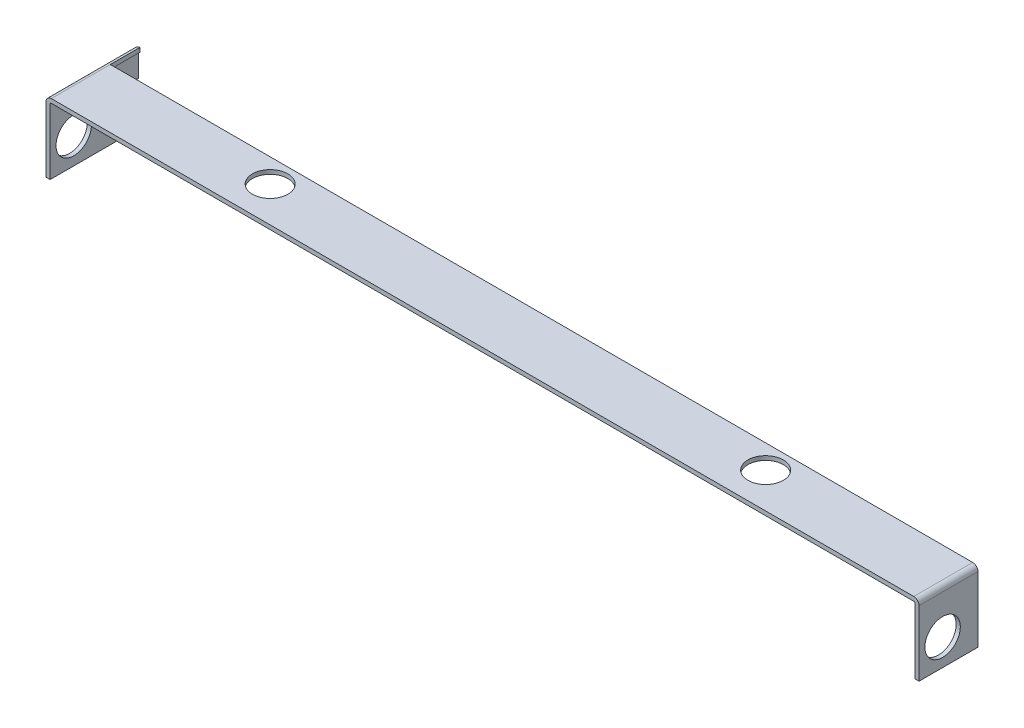
ISO-10303-21;
HEADER;
FILE_DESCRIPTION(('STEP AP214'),'2;1');
FILE_NAME('part.step','',(''),(''),'','','');
FILE_SCHEMA(('AUTOMOTIVE_DESIGN { 1 0 10303 214 1 1 1 1 }'));
ENDSEC;
DATA;
#1=APPLICATION_CONTEXT('core data for automotive mechanical design processes');
#2=APPLICATION_PROTOCOL_DEFINITION('international standard','automotive_design',2000,#1);
#3=PRODUCT_CONTEXT('',#1,'mechanical');
#4=PRODUCT('Part','Part','',(#3));
#5=PRODUCT_RELATED_PRODUCT_CATEGORY('part','',(#4));
#6=PRODUCT_DEFINITION_FORMATION('','',#4);
#7=PRODUCT_DEFINITION_CONTEXT('part definition',#1,'design');
#8=PRODUCT_DEFINITION('design','',#6,#7);
#9=PRODUCT_DEFINITION_SHAPE('','',#8);
#10=(LENGTH_UNIT() NAMED_UNIT(*) SI_UNIT(.MILLI.,.METRE.));
#11=(NAMED_UNIT(*) PLANE_ANGLE_UNIT() SI_UNIT($,.RADIAN.));
#12=(NAMED_UNIT(*) SI_UNIT($,.STERADIAN.) SOLID_ANGLE_UNIT());
#13=UNCERTAINTY_MEASURE_WITH_UNIT(LENGTH_MEASURE(1.E-05),#10,'distance_accuracy_value','');
#14=(GEOMETRIC_REPRESENTATION_CONTEXT(3) GLOBAL_UNCERTAINTY_ASSIGNED_CONTEXT((#13)) GLOBAL_UNIT_ASSIGNED_CONTEXT((#10,
#11,#12)) REPRESENTATION_CONTEXT('',''));
#15=CARTESIAN_POINT('',(0.,0.,0.));
#16=DIRECTION('',(0.,0.,1.));
#17=DIRECTION('',(1.,0.,0.));
#18=AXIS2_PLACEMENT_3D('',#15,#16,#17);
#19=CARTESIAN_POINT('',(-74.,-12.01,31.));
#20=DIRECTION('',(0.,0.,1.));
#21=DIRECTION('',(1.,0.,0.));
#22=AXIS2_PLACEMENT_3D('',#19,#20,#21);
#23=PLANE('',#22);
#24=DIRECTION('',(-1.,0.,0.));
#25=VECTOR('',#24,1.);
#26=CARTESIAN_POINT('',(38.,0.,31.));
#27=LINE('',#26,#25);
#28=CARTESIAN_POINT('',(73.1,0.,31.));
#29=VERTEX_POINT('',#28);
#30=CARTESIAN_POINT('',(-73.1,0.,31.));
#31=VERTEX_POINT('',#30);
#32=EDGE_CURVE('E247',#29,#31,#27,.T.);
#33=ORIENTED_EDGE('',*,*,#32,.T.);
#34=CARTESIAN_POINT('',(-73.1,-0.900000000000013,31.));
#35=DIRECTION('',(0.,0.,1.));
#36=DIRECTION('',(1.,0.,0.));
#37=AXIS2_PLACEMENT_3D('',#34,#35,#36);
#38=CIRCLE('',#37,0.900000000000006);
#39=CARTESIAN_POINT('',(-74.,-0.900000000000009,31.));
#40=VERTEX_POINT('',#39);
#41=EDGE_CURVE('E167',#40,#31,#38,.F.);
#42=ORIENTED_EDGE('',*,*,#41,.F.);
#43=DIRECTION('',(0.,-1.,0.));
#44=VECTOR('',#43,1.);
#45=CARTESIAN_POINT('',(-74.,2.75087301834076E-13,31.));
#46=LINE('',#45,#44);
#47=CARTESIAN_POINT('',(-74.,-12.,31.));
#48=VERTEX_POINT('',#47);
#49=EDGE_CURVE('E181',#40,#48,#46,.T.);
#50=ORIENTED_EDGE('',*,*,#49,.T.);
#51=DIRECTION('',(1.,0.,0.));
#52=VECTOR('',#51,1.);
#53=CARTESIAN_POINT('',(-74.,-12.,31.));
#54=LINE('',#53,#52);
#55=CARTESIAN_POINT('',(-73.3,-12.,31.));
#56=VERTEX_POINT('',#55);
#57=EDGE_CURVE('E173',#48,#56,#54,.T.);
#58=ORIENTED_EDGE('',*,*,#57,.T.);
#59=DIRECTION('',(0.,-1.,0.));
#60=VECTOR('',#59,1.);
#61=CARTESIAN_POINT('',(-73.3,2.72643264896886E-13,31.));
#62=LINE('',#61,#60);
#63=CARTESIAN_POINT('',(-73.3,-0.900000000000012,31.));
#64=VERTEX_POINT('',#63);
#65=EDGE_CURVE('E56',#64,#56,#62,.T.);
#66=ORIENTED_EDGE('',*,*,#65,.F.);
#67=CARTESIAN_POINT('',(-73.1,-0.900000000000013,31.));
#68=DIRECTION('',(0.,0.,1.));
#69=DIRECTION('',(1.,0.,0.));
#70=AXIS2_PLACEMENT_3D('',#67,#68,#69);
#71=CIRCLE('',#70,0.200000000000006);
#72=CARTESIAN_POINT('',(-73.1,-0.700000000000007,31.));
#73=VERTEX_POINT('',#72);
#74=EDGE_CURVE('E188',#64,#73,#71,.F.);
#75=ORIENTED_EDGE('',*,*,#74,.T.);
#76=DIRECTION('',(-1.,0.,0.));
#77=VECTOR('',#76,1.);
#78=CARTESIAN_POINT('',(38.,-0.7,31.));
#79=LINE('',#78,#77);
#80=CARTESIAN_POINT('',(73.1,-0.700000000000021,31.));
#81=VERTEX_POINT('',#80);
#82=EDGE_CURVE('E266',#81,#73,#79,.T.);
#83=ORIENTED_EDGE('',*,*,#82,.F.);
#84=CARTESIAN_POINT('',(73.1,-0.900000000000012,31.));
#85=DIRECTION('',(0.,0.,1.));
#86=DIRECTION('',(1.,0.,0.));
#87=AXIS2_PLACEMENT_3D('',#84,#85,#86);
#88=CIRCLE('',#87,0.199999999999992);
#89=CARTESIAN_POINT('',(73.3,-0.900000000000012,31.));
#90=VERTEX_POINT('',#89);
#91=EDGE_CURVE('E196',#81,#90,#88,.F.);
#92=ORIENTED_EDGE('',*,*,#91,.T.);
#93=DIRECTION('',(0.,1.,0.));
#94=VECTOR('',#93,1.);
#95=CARTESIAN_POINT('',(73.3,1.81762176597924E-13,31.));
#96=LINE('',#95,#94);
#97=CARTESIAN_POINT('',(73.3,-12.,31.));
#98=VERTEX_POINT('',#97);
#99=EDGE_CURVE('E212',#98,#90,#96,.T.);
#100=ORIENTED_EDGE('',*,*,#99,.F.);
#101=DIRECTION('',(1.,0.,0.));
#102=VECTOR('',#101,1.);
#103=CARTESIAN_POINT('',(74.,-12.,31.));
#104=LINE('',#103,#102);
#105=CARTESIAN_POINT('',(74.,-12.,31.));
#106=VERTEX_POINT('',#105);
#107=EDGE_CURVE('E187',#98,#106,#104,.T.);
#108=ORIENTED_EDGE('',*,*,#107,.T.);
#109=DIRECTION('',(0.,1.,0.));
#110=VECTOR('',#109,1.);
#111=CARTESIAN_POINT('',(74.,1.84206213535114E-13,31.));
#112=LINE('',#111,#110);
#113=CARTESIAN_POINT('',(74.,-0.90000000000001,31.));
#114=VERTEX_POINT('',#113);
#115=EDGE_CURVE('E192',#106,#114,#112,.T.);
#116=ORIENTED_EDGE('',*,*,#115,.T.);
#117=CARTESIAN_POINT('',(73.1,-0.900000000000012,31.));
#118=DIRECTION('',(0.,0.,1.));
#119=DIRECTION('',(1.,0.,0.));
#120=AXIS2_PLACEMENT_3D('',#117,#118,#119);
#121=CIRCLE('',#120,0.899999999999992);
#122=EDGE_CURVE('E208',#29,#114,#121,.F.);
#123=ORIENTED_EDGE('',*,*,#122,.F.);
#124=EDGE_LOOP('',(#33,#42,#50,#58,#66,#75,#83,#92,#100,#108,#116,#123));
#125=FACE_BOUND('',#124,.T.);
#126=ADVANCED_FACE('F39',(#125),#23,.T.);
#127=CARTESIAN_POINT('',(-73.1,-12.01,16.));
#128=DIRECTION('',(0.,0.,-1.));
#129=DIRECTION('',(-1.,0.,0.));
#130=AXIS2_PLACEMENT_3D('',#127,#128,#129);
#131=PLANE('',#130);
#132=DIRECTION('',(0.,1.,0.));
#133=VECTOR('',#132,1.);
#134=CARTESIAN_POINT('',(-73.3,2.72643264896885E-13,16.));
#135=LINE('',#134,#133);
#136=CARTESIAN_POINT('',(-73.3,-12.,16.));
#137=VERTEX_POINT('',#136);
#138=CARTESIAN_POINT('',(-73.3,-10.3284271247457,16.));
#139=VERTEX_POINT('',#138);
#140=EDGE_CURVE('E161',#137,#139,#135,.T.);
#141=ORIENTED_EDGE('',*,*,#140,.F.);
#142=DIRECTION('',(-1.,0.,0.));
#143=VECTOR('',#142,1.);
#144=CARTESIAN_POINT('',(-73.9999999999999,-12.,16.));
#145=LINE('',#144,#143);
#146=CARTESIAN_POINT('',(-74.,-12.,16.));
#147=VERTEX_POINT('',#146);
#148=EDGE_CURVE('E175',#137,#147,#145,.T.);
#149=ORIENTED_EDGE('',*,*,#148,.T.);
#150=DIRECTION('',(0.,1.,0.));
#151=VECTOR('',#150,1.);
#152=CARTESIAN_POINT('',(-74.,2.75087301834076E-13,16.));
#153=LINE('',#152,#151);
#154=CARTESIAN_POINT('',(-74.,-10.3284271247457,16.));
#155=VERTEX_POINT('',#154);
#156=EDGE_CURVE('E172',#147,#155,#153,.T.);
#157=ORIENTED_EDGE('',*,*,#156,.T.);
#158=DIRECTION('',(-1.,0.,0.));
#159=VECTOR('',#158,1.);
#160=CARTESIAN_POINT('',(-64.,-10.3284271247457,16.));
#161=LINE('',#160,#159);
#162=EDGE_CURVE('E154',#155,#139,#161,.F.);
#163=ORIENTED_EDGE('',*,*,#162,.T.);
#164=EDGE_LOOP('',(#141,#149,#157,#163));
#165=FACE_BOUND('',#164,.T.);
#166=ADVANCED_FACE('F170',(#165),#131,.T.);
#167=CARTESIAN_POINT('',(-73.1,-0.900000000000013,16.));
#168=DIRECTION('',(0.,0.,-1.));
#169=DIRECTION('',(-1.,0.,0.));
#170=AXIS2_PLACEMENT_3D('',#167,#168,#169);
#171=CIRCLE('',#170,0.900000000000006);
#172=CARTESIAN_POINT('',(-73.1,0.,16.));
#173=VERTEX_POINT('',#172);
#174=CARTESIAN_POINT('',(-74.,-0.900000000000009,16.));
#175=VERTEX_POINT('',#174);
#176=EDGE_CURVE('E213',#173,#175,#171,.F.);
#177=ORIENTED_EDGE('',*,*,#176,.F.);
#178=DIRECTION('',(0.,1.,0.));
#179=VECTOR('',#178,1.);
#180=CARTESIAN_POINT('',(-73.1,-12.01,16.));
#181=LINE('',#180,#179);
#182=CARTESIAN_POINT('',(-73.1,-0.700000000000007,16.));
#183=VERTEX_POINT('',#182);
#184=EDGE_CURVE('E11',#183,#173,#181,.T.);
#185=ORIENTED_EDGE('',*,*,#184,.F.);
#186=CARTESIAN_POINT('',(-73.1,-0.900000000000013,16.));
#187=DIRECTION('',(0.,0.,-1.));
#188=DIRECTION('',(-1.,0.,0.));
#189=AXIS2_PLACEMENT_3D('',#186,#187,#188);
#190=CIRCLE('',#189,0.200000000000006);
#191=CARTESIAN_POINT('',(-73.3,-0.900000000000012,16.));
#192=VERTEX_POINT('',#191);
#193=EDGE_CURVE('E185',#183,#192,#190,.F.);
#194=ORIENTED_EDGE('',*,*,#193,.T.);
#195=CARTESIAN_POINT('',(-73.3,-4.67157287525326,16.));
#196=VERTEX_POINT('',#195);
#197=EDGE_CURVE('E64',#196,#192,#135,.T.);
#198=ORIENTED_EDGE('',*,*,#197,.F.);
#199=DIRECTION('',(-1.,0.,0.));
#200=VECTOR('',#199,1.);
#201=CARTESIAN_POINT('',(-64.,-4.6715728752533,16.));
#202=LINE('',#201,#200);
#203=CARTESIAN_POINT('',(-74.,-4.67157287525326,16.));
#204=VERTEX_POINT('',#203);
#205=EDGE_CURVE('E156',#196,#204,#202,.T.);
#206=ORIENTED_EDGE('',*,*,#205,.T.);
#207=EDGE_CURVE('E182',#204,#175,#153,.T.);
#208=ORIENTED_EDGE('',*,*,#207,.T.);
#209=EDGE_LOOP('',(#177,#185,#194,#198,#206,#208));
#210=FACE_BOUND('',#209,.T.);
#211=ADVANCED_FACE('F295',(#210),#131,.T.);
#212=CARTESIAN_POINT('',(-73.1,-12.01,21.));
#213=DIRECTION('',(1.,0.,0.));
#214=DIRECTION('',(0.,0.,-1.));
#215=AXIS2_PLACEMENT_3D('',#212,#213,#214);
#216=PLANE('',#215);
#217=DIRECTION('',(0.,1.,0.));
#218=VECTOR('',#217,1.);
#219=CARTESIAN_POINT('',(-73.1,-12.01,21.));
#220=LINE('',#219,#218);
#221=CARTESIAN_POINT('',(-73.1,-0.700000000000007,21.));
#222=VERTEX_POINT('',#221);
#223=CARTESIAN_POINT('',(-73.1,0.,21.));
#224=VERTEX_POINT('',#223);
#225=EDGE_CURVE('E48',#222,#224,#220,.T.);
#226=ORIENTED_EDGE('',*,*,#225,.F.);
#227=DIRECTION('',(0.,0.,-1.));
#228=VECTOR('',#227,1.);
#229=CARTESIAN_POINT('',(-73.1,-0.700000000000007,-45.));
#230=LINE('',#229,#228);
#231=EDGE_CURVE('E228',#183,#222,#230,.F.);
#232=ORIENTED_EDGE('',*,*,#231,.F.);
#233=ORIENTED_EDGE('',*,*,#184,.T.);
#234=DIRECTION('',(0.,0.,-1.));
#235=VECTOR('',#234,1.);
#236=CARTESIAN_POINT('',(-73.1,0.,-45.));
#237=LINE('',#236,#235);
#238=EDGE_CURVE('E177',#173,#224,#237,.F.);
#239=ORIENTED_EDGE('',*,*,#238,.T.);
#240=EDGE_LOOP('',(#226,#232,#233,#239));
#241=FACE_BOUND('',#240,.T.);
#242=ADVANCED_FACE('F330',(#241),#216,.T.);
#243=CARTESIAN_POINT('',(-73.1,-12.01,21.));
#244=DIRECTION('',(0.,0.,-1.));
#245=DIRECTION('',(-1.,0.,0.));
#246=AXIS2_PLACEMENT_3D('',#243,#244,#245);
#247=PLANE('',#246);
#248=CARTESIAN_POINT('',(73.1,-0.900000000000012,21.));
#249=DIRECTION('',(0.,0.,-1.));
#250=DIRECTION('',(-1.,0.,0.));
#251=AXIS2_PLACEMENT_3D('',#248,#249,#250);
#252=CIRCLE('',#251,0.899999999999992);
#253=CARTESIAN_POINT('',(74.,-0.90000000000001,21.));
#254=VERTEX_POINT('',#253);
#255=CARTESIAN_POINT('',(73.1,0.,21.));
#256=VERTEX_POINT('',#255);
#257=EDGE_CURVE('E206',#254,#256,#252,.F.);
#258=ORIENTED_EDGE('',*,*,#257,.F.);
#259=DIRECTION('',(0.,-1.,0.));
#260=VECTOR('',#259,1.);
#261=CARTESIAN_POINT('',(74.,1.84206213535114E-13,21.));
#262=LINE('',#261,#260);
#263=CARTESIAN_POINT('',(74.,-12.,21.));
#264=VERTEX_POINT('',#263);
#265=EDGE_CURVE('E193',#254,#264,#262,.T.);
#266=ORIENTED_EDGE('',*,*,#265,.T.);
#267=DIRECTION('',(-1.,0.,0.));
#268=VECTOR('',#267,1.);
#269=CARTESIAN_POINT('',(74.,-12.,21.));
#270=LINE('',#269,#268);
#271=CARTESIAN_POINT('',(73.3,-12.,21.));
#272=VERTEX_POINT('',#271);
#273=EDGE_CURVE('E189',#264,#272,#270,.T.);
#274=ORIENTED_EDGE('',*,*,#273,.T.);
#275=DIRECTION('',(0.,-1.,0.));
#276=VECTOR('',#275,1.);
#277=CARTESIAN_POINT('',(73.3,1.81762176597924E-13,21.));
#278=LINE('',#277,#276);
#279=CARTESIAN_POINT('',(73.3,-0.900000000000012,21.));
#280=VERTEX_POINT('',#279);
#281=EDGE_CURVE('E209',#280,#272,#278,.T.);
#282=ORIENTED_EDGE('',*,*,#281,.F.);
#283=CARTESIAN_POINT('',(73.1,-0.900000000000012,21.));
#284=DIRECTION('',(0.,0.,-1.));
#285=DIRECTION('',(-1.,0.,0.));
#286=AXIS2_PLACEMENT_3D('',#283,#284,#285);
#287=CIRCLE('',#286,0.199999999999992);
#288=CARTESIAN_POINT('',(73.1,-0.700000000000021,21.));
#289=VERTEX_POINT('',#288);
#290=EDGE_CURVE('E197',#280,#289,#287,.F.);
#291=ORIENTED_EDGE('',*,*,#290,.T.);
#292=DIRECTION('',(-1.,0.,0.));
#293=VECTOR('',#292,1.);
#294=CARTESIAN_POINT('',(0.,-0.7,21.));
#295=LINE('',#294,#293);
#296=EDGE_CURVE('E200',#289,#222,#295,.T.);
#297=ORIENTED_EDGE('',*,*,#296,.T.);
#298=ORIENTED_EDGE('',*,*,#225,.T.);
#299=DIRECTION('',(-1.,0.,0.));
#300=VECTOR('',#299,1.);
#301=CARTESIAN_POINT('',(0.,0.,21.));
#302=LINE('',#301,#300);
#303=EDGE_CURVE('E203',#256,#224,#302,.T.);
#304=ORIENTED_EDGE('',*,*,#303,.F.);
#305=EDGE_LOOP('',(#258,#266,#274,#282,#291,#297,#298,#304));
#306=FACE_BOUND('',#305,.T.);
#307=ADVANCED_FACE('F320',(#306),#247,.T.);
#308=CARTESIAN_POINT('',(0.,0.,0.));
#309=DIRECTION('',(0.,1.,0.));
#310=DIRECTION('',(0.,0.,1.));
#311=AXIS2_PLACEMENT_3D('',#308,#309,#310);
#312=PLANE('',#311);
#313=CARTESIAN_POINT('',(-42.,0.,25.));
#314=DIRECTION('',(0.,1.,0.));
#315=DIRECTION('',(0.,0.,1.));
#316=AXIS2_PLACEMENT_3D('',#313,#314,#315);
#317=CIRCLE('',#316,3.);
#318=CARTESIAN_POINT('',(-42.,0.,28.));
#319=VERTEX_POINT('',#318);
#320=EDGE_CURVE('E250',#319,#319,#317,.T.);
#321=ORIENTED_EDGE('',*,*,#320,.F.);
#322=EDGE_LOOP('',(#321));
#323=FACE_BOUND('',#322,.T.);
#324=CARTESIAN_POINT('',(42.,0.,25.));
#325=DIRECTION('',(0.,1.,0.));
#326=DIRECTION('',(0.,0.,-1.));
#327=AXIS2_PLACEMENT_3D('',#324,#325,#326);
#328=CIRCLE('',#327,3.);
#329=CARTESIAN_POINT('',(42.,0.,22.));
#330=VERTEX_POINT('',#329);
#331=EDGE_CURVE('E255',#330,#330,#328,.T.);
#332=ORIENTED_EDGE('',*,*,#331,.F.);
#333=EDGE_LOOP('',(#332));
#334=FACE_BOUND('',#333,.T.);
#335=DIRECTION('',(0.,0.,1.));
#336=VECTOR('',#335,1.);
#337=CARTESIAN_POINT('',(73.1,0.,45.));
#338=LINE('',#337,#336);
#339=EDGE_CURVE('E245',#29,#256,#338,.F.);
#340=ORIENTED_EDGE('',*,*,#339,.T.);
#341=ORIENTED_EDGE('',*,*,#303,.T.);
#342=EDGE_CURVE('E231',#224,#31,#237,.F.);
#343=ORIENTED_EDGE('',*,*,#342,.T.);
#344=ORIENTED_EDGE('',*,*,#32,.F.);
#345=EDGE_LOOP('',(#340,#341,#343,#344));
#346=FACE_BOUND('',#345,.T.);
#347=ADVANCED_FACE('F317',(#323,#334,#346),#312,.T.);
#348=CARTESIAN_POINT('',(0.,-0.7,0.));
#349=DIRECTION('',(0.,1.,0.));
#350=DIRECTION('',(0.,0.,1.));
#351=AXIS2_PLACEMENT_3D('',#348,#349,#350);
#352=PLANE('',#351);
#353=CARTESIAN_POINT('',(-42.,-0.699999999999999,25.));
#354=DIRECTION('',(0.,1.,0.));
#355=DIRECTION('',(0.,0.,1.));
#356=AXIS2_PLACEMENT_3D('',#353,#354,#355);
#357=CIRCLE('',#356,3.);
#358=CARTESIAN_POINT('',(-42.,-0.699999999999999,28.));
#359=VERTEX_POINT('',#358);
#360=EDGE_CURVE('E43',#359,#359,#357,.T.);
#361=ORIENTED_EDGE('',*,*,#360,.T.);
#362=EDGE_LOOP('',(#361));
#363=FACE_BOUND('',#362,.T.);
#364=CARTESIAN_POINT('',(42.,-0.699999999999999,25.));
#365=DIRECTION('',(0.,1.,0.));
#366=DIRECTION('',(0.,0.,1.));
#367=AXIS2_PLACEMENT_3D('',#364,#365,#366);
#368=CIRCLE('',#367,3.);
#369=CARTESIAN_POINT('',(42.,-0.699999999999999,28.));
#370=VERTEX_POINT('',#369);
#371=EDGE_CURVE('E248',#370,#370,#368,.T.);
#372=ORIENTED_EDGE('',*,*,#371,.T.);
#373=EDGE_LOOP('',(#372));
#374=FACE_BOUND('',#373,.T.);
#375=ORIENTED_EDGE('',*,*,#296,.F.);
#376=DIRECTION('',(0.,0.,1.));
#377=VECTOR('',#376,1.);
#378=CARTESIAN_POINT('',(73.1,-0.700000000000021,45.));
#379=LINE('',#378,#377);
#380=EDGE_CURVE('E243',#81,#289,#379,.F.);
#381=ORIENTED_EDGE('',*,*,#380,.F.);
#382=ORIENTED_EDGE('',*,*,#82,.T.);
#383=EDGE_CURVE('E225',#222,#73,#230,.F.);
#384=ORIENTED_EDGE('',*,*,#383,.F.);
#385=EDGE_LOOP('',(#375,#381,#382,#384));
#386=FACE_BOUND('',#385,.T.);
#387=ADVANCED_FACE('F319',(#363,#374,#386),#352,.F.);
#388=CARTESIAN_POINT('',(-73.1,-0.900000000000013,-45.));
#389=DIRECTION('',(0.,0.,-1.));
#390=DIRECTION('',(-1.,0.,0.));
#391=AXIS2_PLACEMENT_3D('',#388,#389,#390);
#392=CYLINDRICAL_SURFACE('',#391,0.900000000000006);
#393=ORIENTED_EDGE('',*,*,#238,.F.);
#394=ORIENTED_EDGE('',*,*,#176,.T.);
#395=DIRECTION('',(0.,0.,-1.));
#396=VECTOR('',#395,1.);
#397=CARTESIAN_POINT('',(-74.,-0.900000000000009,45.));
#398=LINE('',#397,#396);
#399=EDGE_CURVE('E220',#175,#40,#398,.F.);
#400=ORIENTED_EDGE('',*,*,#399,.T.);
#401=ORIENTED_EDGE('',*,*,#41,.T.);
#402=ORIENTED_EDGE('',*,*,#342,.F.);
#403=EDGE_LOOP('',(#393,#394,#400,#401,#402));
#404=FACE_BOUND('',#403,.T.);
#405=ADVANCED_FACE('F327',(#404),#392,.T.);
#406=CARTESIAN_POINT('',(-73.1,-0.900000000000013,-45.));
#407=DIRECTION('',(0.,0.,-1.));
#408=DIRECTION('',(-1.,0.,0.));
#409=AXIS2_PLACEMENT_3D('',#406,#407,#408);
#410=CYLINDRICAL_SURFACE('',#409,0.200000000000006);
#411=ORIENTED_EDGE('',*,*,#193,.F.);
#412=ORIENTED_EDGE('',*,*,#231,.T.);
#413=ORIENTED_EDGE('',*,*,#383,.T.);
#414=ORIENTED_EDGE('',*,*,#74,.F.);
#415=DIRECTION('',(0.,0.,-1.));
#416=VECTOR('',#415,1.);
#417=CARTESIAN_POINT('',(-73.3,-0.900000000000012,45.));
#418=LINE('',#417,#416);
#419=EDGE_CURVE('E158',#64,#192,#418,.T.);
#420=ORIENTED_EDGE('',*,*,#419,.T.);
#421=EDGE_LOOP('',(#411,#412,#413,#414,#420));
#422=FACE_BOUND('',#421,.T.);
#423=ADVANCED_FACE('F300',(#422),#410,.F.);
#424=CARTESIAN_POINT('',(-64.,-7.49999999999949,27.));
#425=DIRECTION('',(-1.,0.,0.));
#426=DIRECTION('',(0.,-1.,0.));
#427=AXIS2_PLACEMENT_3D('',#424,#425,#426);
#428=CYLINDRICAL_SURFACE('',#427,3.);
#429=CARTESIAN_POINT('',(-73.3,-7.49999999999946,27.));
#430=DIRECTION('',(1.,0.,0.));
#431=DIRECTION('',(0.,1.,0.));
#432=AXIS2_PLACEMENT_3D('',#429,#430,#431);
#433=CIRCLE('',#432,3.);
#434=CARTESIAN_POINT('',(-73.3,-4.49999999999946,27.));
#435=VERTEX_POINT('',#434);
#436=EDGE_CURVE('E157',#435,#435,#433,.T.);
#437=ORIENTED_EDGE('',*,*,#436,.T.);
#438=EDGE_LOOP('',(#437));
#439=FACE_BOUND('',#438,.T.);
#440=CARTESIAN_POINT('',(-74.,-7.49999999999946,27.));
#441=DIRECTION('',(-1.,0.,0.));
#442=DIRECTION('',(0.,-1.,0.));
#443=AXIS2_PLACEMENT_3D('',#440,#441,#442);
#444=CIRCLE('',#443,3.);
#445=CARTESIAN_POINT('',(-74.,-10.4999999999995,27.));
#446=VERTEX_POINT('',#445);
#447=EDGE_CURVE('E216',#446,#446,#444,.T.);
#448=ORIENTED_EDGE('',*,*,#447,.T.);
#449=EDGE_LOOP('',(#448));
#450=FACE_BOUND('',#449,.T.);
#451=ADVANCED_FACE('F340',(#439,#450),#428,.F.);
#452=CARTESIAN_POINT('',(-73.3,2.72643264896886E-13,0.));
#453=DIRECTION('',(1.,0.,0.));
#454=DIRECTION('',(0.,1.,0.));
#455=AXIS2_PLACEMENT_3D('',#452,#453,#454);
#456=PLANE('',#455);
#457=ORIENTED_EDGE('',*,*,#436,.F.);
#458=EDGE_LOOP('',(#457));
#459=FACE_BOUND('',#458,.T.);
#460=DIRECTION('',(0.,0.,-1.));
#461=VECTOR('',#460,1.);
#462=CARTESIAN_POINT('',(-73.3,-12.,45.));
#463=LINE('',#462,#461);
#464=EDGE_CURVE('E163',#137,#56,#463,.F.);
#465=ORIENTED_EDGE('',*,*,#464,.F.);
#466=ORIENTED_EDGE('',*,*,#140,.T.);
#467=CARTESIAN_POINT('',(-73.3,-7.49999999999946,17.));
#468=DIRECTION('',(1.,0.,0.));
#469=DIRECTION('',(0.,1.,0.));
#470=AXIS2_PLACEMENT_3D('',#467,#468,#469);
#471=CIRCLE('',#470,3.);
#472=EDGE_CURVE('E150',#196,#139,#471,.T.);
#473=ORIENTED_EDGE('',*,*,#472,.F.);
#474=ORIENTED_EDGE('',*,*,#197,.T.);
#475=ORIENTED_EDGE('',*,*,#419,.F.);
#476=ORIENTED_EDGE('',*,*,#65,.T.);
#477=EDGE_LOOP('',(#465,#466,#473,#474,#475,#476));
#478=FACE_BOUND('',#477,.T.);
#479=ADVANCED_FACE('F162',(#459,#478),#456,.T.);
#480=CARTESIAN_POINT('',(-74.,2.75087301834076E-13,0.));
#481=DIRECTION('',(1.,0.,0.));
#482=DIRECTION('',(0.,1.,0.));
#483=AXIS2_PLACEMENT_3D('',#480,#481,#482);
#484=PLANE('',#483);
#485=ORIENTED_EDGE('',*,*,#447,.F.);
#486=EDGE_LOOP('',(#485));
#487=FACE_BOUND('',#486,.T.);
#488=ORIENTED_EDGE('',*,*,#156,.F.);
#489=DIRECTION('',(0.,0.,1.));
#490=VECTOR('',#489,1.);
#491=CARTESIAN_POINT('',(-74.,-12.,0.));
#492=LINE('',#491,#490);
#493=EDGE_CURVE('E223',#147,#48,#492,.T.);
#494=ORIENTED_EDGE('',*,*,#493,.T.);
#495=ORIENTED_EDGE('',*,*,#49,.F.);
#496=ORIENTED_EDGE('',*,*,#399,.F.);
#497=ORIENTED_EDGE('',*,*,#207,.F.);
#498=CARTESIAN_POINT('',(-74.,-7.49999999999946,17.));
#499=DIRECTION('',(-1.,0.,0.));
#500=DIRECTION('',(0.,-1.,0.));
#501=AXIS2_PLACEMENT_3D('',#498,#499,#500);
#502=CIRCLE('',#501,3.);
#503=EDGE_CURVE('E264',#155,#204,#502,.T.);
#504=ORIENTED_EDGE('',*,*,#503,.F.);
#505=EDGE_LOOP('',(#488,#494,#495,#496,#497,#504));
#506=FACE_BOUND('',#505,.T.);
#507=ADVANCED_FACE('F291',(#487,#506),#484,.F.);
#508=CARTESIAN_POINT('',(-64.,-7.49999999999949,17.));
#509=DIRECTION('',(-1.,0.,0.));
#510=DIRECTION('',(0.,-1.,0.));
#511=AXIS2_PLACEMENT_3D('',#508,#509,#510);
#512=CYLINDRICAL_SURFACE('',#511,3.);
#513=ORIENTED_EDGE('',*,*,#162,.F.);
#514=ORIENTED_EDGE('',*,*,#503,.T.);
#515=ORIENTED_EDGE('',*,*,#205,.F.);
#516=ORIENTED_EDGE('',*,*,#472,.T.);
#517=EDGE_LOOP('',(#513,#514,#515,#516));
#518=FACE_BOUND('',#517,.T.);
#519=ADVANCED_FACE('F152',(#518),#512,.F.);
#520=CARTESIAN_POINT('',(-74.,-12.,45.));
#521=DIRECTION('',(0.,1.,0.));
#522=DIRECTION('',(-1.,0.,0.));
#523=AXIS2_PLACEMENT_3D('',#520,#521,#522);
#524=PLANE('',#523);
#525=ORIENTED_EDGE('',*,*,#148,.F.);
#526=ORIENTED_EDGE('',*,*,#464,.T.);
#527=ORIENTED_EDGE('',*,*,#57,.F.);
#528=ORIENTED_EDGE('',*,*,#493,.F.);
#529=EDGE_LOOP('',(#525,#526,#527,#528));
#530=FACE_BOUND('',#529,.T.);
#531=ADVANCED_FACE('F304',(#530),#524,.F.);
#532=CARTESIAN_POINT('',(73.1,-0.900000000000012,45.));
#533=DIRECTION('',(0.,0.,1.));
#534=DIRECTION('',(1.,0.,0.));
#535=AXIS2_PLACEMENT_3D('',#532,#533,#534);
#536=CYLINDRICAL_SURFACE('',#535,0.899999999999992);
#537=DIRECTION('',(0.,0.,1.));
#538=VECTOR('',#537,1.);
#539=CARTESIAN_POINT('',(74.,-0.90000000000001,-45.));
#540=LINE('',#539,#538);
#541=EDGE_CURVE('E235',#114,#254,#540,.F.);
#542=ORIENTED_EDGE('',*,*,#541,.T.);
#543=ORIENTED_EDGE('',*,*,#257,.T.);
#544=ORIENTED_EDGE('',*,*,#339,.F.);
#545=ORIENTED_EDGE('',*,*,#122,.T.);
#546=EDGE_LOOP('',(#542,#543,#544,#545));
#547=FACE_BOUND('',#546,.T.);
#548=ADVANCED_FACE('F306',(#547),#536,.T.);
#549=CARTESIAN_POINT('',(73.1,-0.900000000000012,45.));
#550=DIRECTION('',(0.,0.,1.));
#551=DIRECTION('',(1.,0.,0.));
#552=AXIS2_PLACEMENT_3D('',#549,#550,#551);
#553=CYLINDRICAL_SURFACE('',#552,0.199999999999992);
#554=ORIENTED_EDGE('',*,*,#290,.F.);
#555=DIRECTION('',(0.,0.,1.));
#556=VECTOR('',#555,1.);
#557=CARTESIAN_POINT('',(73.3,-0.900000000000012,-45.));
#558=LINE('',#557,#556);
#559=EDGE_CURVE('E232',#280,#90,#558,.T.);
#560=ORIENTED_EDGE('',*,*,#559,.T.);
#561=ORIENTED_EDGE('',*,*,#91,.F.);
#562=ORIENTED_EDGE('',*,*,#380,.T.);
#563=EDGE_LOOP('',(#554,#560,#561,#562));
#564=FACE_BOUND('',#563,.T.);
#565=ADVANCED_FACE('F312',(#564),#553,.F.);
#566=CARTESIAN_POINT('',(74.,-7.5,27.));
#567=DIRECTION('',(-1.,0.,0.));
#568=DIRECTION('',(0.,-1.,0.));
#569=AXIS2_PLACEMENT_3D('',#566,#567,#568);
#570=CYLINDRICAL_SURFACE('',#569,3.);
#571=CARTESIAN_POINT('',(74.,-7.5,27.));
#572=DIRECTION('',(-1.,0.,0.));
#573=DIRECTION('',(0.,-1.,0.));
#574=AXIS2_PLACEMENT_3D('',#571,#572,#573);
#575=CIRCLE('',#574,3.);
#576=CARTESIAN_POINT('',(74.,-10.5,27.));
#577=VERTEX_POINT('',#576);
#578=EDGE_CURVE('E240',#577,#577,#575,.F.);
#579=ORIENTED_EDGE('',*,*,#578,.T.);
#580=EDGE_LOOP('',(#579));
#581=FACE_BOUND('',#580,.T.);
#582=CARTESIAN_POINT('',(73.3,-7.5,27.));
#583=DIRECTION('',(-1.,0.,0.));
#584=DIRECTION('',(0.,-1.,0.));
#585=AXIS2_PLACEMENT_3D('',#582,#583,#584);
#586=CIRCLE('',#585,3.);
#587=CARTESIAN_POINT('',(73.3,-10.5,27.));
#588=VERTEX_POINT('',#587);
#589=EDGE_CURVE('E237',#588,#588,#586,.F.);
#590=ORIENTED_EDGE('',*,*,#589,.F.);
#591=EDGE_LOOP('',(#590));
#592=FACE_BOUND('',#591,.T.);
#593=ADVANCED_FACE('F356',(#581,#592),#570,.F.);
#594=CARTESIAN_POINT('',(73.3,1.81762176597924E-13,0.));
#595=DIRECTION('',(-1.,0.,0.));
#596=DIRECTION('',(0.,-1.,0.));
#597=AXIS2_PLACEMENT_3D('',#594,#595,#596);
#598=PLANE('',#597);
#599=ORIENTED_EDGE('',*,*,#589,.T.);
#600=EDGE_LOOP('',(#599));
#601=FACE_BOUND('',#600,.T.);
#602=ORIENTED_EDGE('',*,*,#559,.F.);
#603=ORIENTED_EDGE('',*,*,#281,.T.);
#604=DIRECTION('',(0.,0.,1.));
#605=VECTOR('',#604,1.);
#606=CARTESIAN_POINT('',(73.3,-12.,-45.));
#607=LINE('',#606,#605);
#608=EDGE_CURVE('E238',#98,#272,#607,.F.);
#609=ORIENTED_EDGE('',*,*,#608,.F.);
#610=ORIENTED_EDGE('',*,*,#99,.T.);
#611=EDGE_LOOP('',(#602,#603,#609,#610));
#612=FACE_BOUND('',#611,.T.);
#613=ADVANCED_FACE('F447',(#601,#612),#598,.T.);
#614=CARTESIAN_POINT('',(74.,1.84206213535114E-13,0.));
#615=DIRECTION('',(-1.,0.,0.));
#616=DIRECTION('',(0.,-1.,0.));
#617=AXIS2_PLACEMENT_3D('',#614,#615,#616);
#618=PLANE('',#617);
#619=ORIENTED_EDGE('',*,*,#578,.F.);
#620=EDGE_LOOP('',(#619));
#621=FACE_BOUND('',#620,.T.);
#622=ORIENTED_EDGE('',*,*,#265,.F.);
#623=ORIENTED_EDGE('',*,*,#541,.F.);
#624=ORIENTED_EDGE('',*,*,#115,.F.);
#625=DIRECTION('',(0.,0.,-1.));
#626=VECTOR('',#625,1.);
#627=CARTESIAN_POINT('',(74.,-12.,0.));
#628=LINE('',#627,#626);
#629=EDGE_CURVE('E241',#106,#264,#628,.T.);
#630=ORIENTED_EDGE('',*,*,#629,.T.);
#631=EDGE_LOOP('',(#622,#623,#624,#630));
#632=FACE_BOUND('',#631,.T.);
#633=ADVANCED_FACE('F457',(#621,#632),#618,.F.);
#634=CARTESIAN_POINT('',(74.,-12.,-45.));
#635=DIRECTION('',(0.,1.,0.));
#636=DIRECTION('',(-1.,0.,0.));
#637=AXIS2_PLACEMENT_3D('',#634,#635,#636);
#638=PLANE('',#637);
#639=ORIENTED_EDGE('',*,*,#273,.F.);
#640=ORIENTED_EDGE('',*,*,#629,.F.);
#641=ORIENTED_EDGE('',*,*,#107,.F.);
#642=ORIENTED_EDGE('',*,*,#608,.T.);
#643=EDGE_LOOP('',(#639,#640,#641,#642));
#644=FACE_BOUND('',#643,.T.);
#645=ADVANCED_FACE('F41',(#644),#638,.F.);
#646=CARTESIAN_POINT('',(42.,-10.,25.));
#647=DIRECTION('',(0.,1.,0.));
#648=DIRECTION('',(0.,0.,1.));
#649=AXIS2_PLACEMENT_3D('',#646,#647,#648);
#650=CYLINDRICAL_SURFACE('',#649,3.);
#651=ORIENTED_EDGE('',*,*,#331,.T.);
#652=EDGE_LOOP('',(#651));
#653=FACE_BOUND('',#652,.T.);
#654=ORIENTED_EDGE('',*,*,#371,.F.);
#655=EDGE_LOOP('',(#654));
#656=FACE_BOUND('',#655,.T.);
#657=ADVANCED_FACE('F363',(#653,#656),#650,.F.);
#658=CARTESIAN_POINT('',(-42.,-10.,25.));
#659=DIRECTION('',(0.,1.,0.));
#660=DIRECTION('',(0.,0.,1.));
#661=AXIS2_PLACEMENT_3D('',#658,#659,#660);
#662=CYLINDRICAL_SURFACE('',#661,3.);
#663=ORIENTED_EDGE('',*,*,#320,.T.);
#664=EDGE_LOOP('',(#663));
#665=FACE_BOUND('',#664,.T.);
#666=ORIENTED_EDGE('',*,*,#360,.F.);
#667=EDGE_LOOP('',(#666));
#668=FACE_BOUND('',#667,.T.);
#669=ADVANCED_FACE('F496',(#665,#668),#662,.F.);
#670=CLOSED_SHELL('',(#126,#166,#211,#242,#307,#347,#387,#405,#423,#451,#479,#507,#519,#531,
#548,#565,#593,#613,#633,#645,#657,#669));
#671=MANIFOLD_SOLID_BREP('B2',#670);
#672=ADVANCED_BREP_SHAPE_REPRESENTATION('',(#18,#671),#14);
#673=SHAPE_DEFINITION_REPRESENTATION(#9,#672);
ENDSEC;
END-ISO-10303-21;
